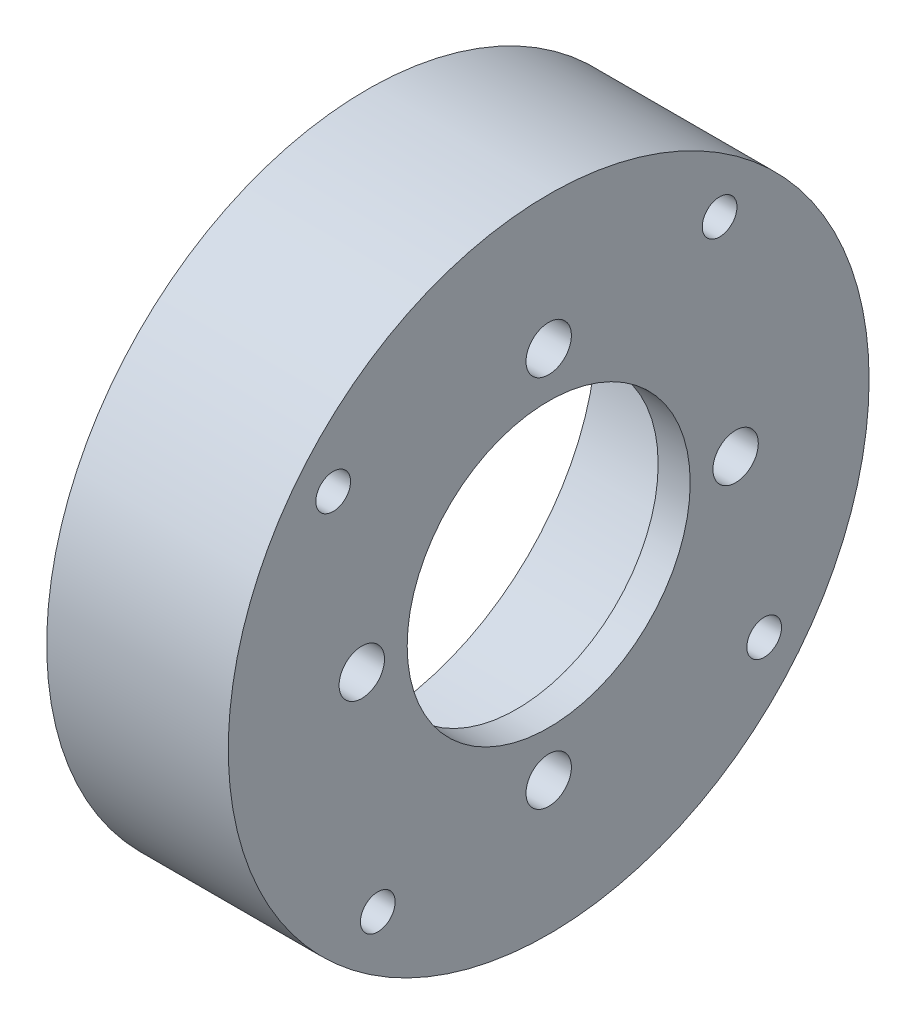
ISO-10303-21;
HEADER;
FILE_DESCRIPTION(('STEP AP214'),'2;1');
FILE_NAME('part.step','',(''),(''),'','','');
FILE_SCHEMA(('AUTOMOTIVE_DESIGN { 1 0 10303 214 1 1 1 1 }'));
ENDSEC;
DATA;
#1=APPLICATION_CONTEXT('core data for automotive mechanical design processes');
#2=APPLICATION_PROTOCOL_DEFINITION('international standard','automotive_design',2000,#1);
#3=PRODUCT_CONTEXT('',#1,'mechanical');
#4=PRODUCT('Part','Part','',(#3));
#5=PRODUCT_RELATED_PRODUCT_CATEGORY('part','',(#4));
#6=PRODUCT_DEFINITION_FORMATION('','',#4);
#7=PRODUCT_DEFINITION_CONTEXT('part definition',#1,'design');
#8=PRODUCT_DEFINITION('design','',#6,#7);
#9=PRODUCT_DEFINITION_SHAPE('','',#8);
#10=(LENGTH_UNIT() NAMED_UNIT(*) SI_UNIT(.MILLI.,.METRE.));
#11=(NAMED_UNIT(*) PLANE_ANGLE_UNIT() SI_UNIT($,.RADIAN.));
#12=(NAMED_UNIT(*) SI_UNIT($,.STERADIAN.) SOLID_ANGLE_UNIT());
#13=UNCERTAINTY_MEASURE_WITH_UNIT(LENGTH_MEASURE(1.E-05),#10,'distance_accuracy_value','');
#14=(GEOMETRIC_REPRESENTATION_CONTEXT(3) GLOBAL_UNCERTAINTY_ASSIGNED_CONTEXT((#13)) GLOBAL_UNIT_ASSIGNED_CONTEXT((#10,
#11,#12)) REPRESENTATION_CONTEXT('',''));
#15=CARTESIAN_POINT('',(0.,0.,0.));
#16=DIRECTION('',(0.,0.,1.));
#17=DIRECTION('',(1.,0.,0.));
#18=AXIS2_PLACEMENT_3D('',#15,#16,#17);
#19=CARTESIAN_POINT('',(0.,0.,0.));
#20=DIRECTION('',(1.,0.,0.));
#21=DIRECTION('',(0.,0.,-1.));
#22=AXIS2_PLACEMENT_3D('',#19,#20,#21);
#23=PLANE('',#22);
#24=CARTESIAN_POINT('',(0.,16.,20.1757899473602));
#25=DIRECTION('',(1.,0.,0.));
#26=DIRECTION('',(0.,0.,-1.));
#27=AXIS2_PLACEMENT_3D('',#24,#25,#26);
#28=CIRCLE('',#27,1.625);
#29=CARTESIAN_POINT('',(0.,16.,18.5507899473602));
#30=VERTEX_POINT('',#29);
#31=EDGE_CURVE('E91',#30,#30,#28,.T.);
#32=ORIENTED_EDGE('',*,*,#31,.T.);
#33=EDGE_LOOP('',(#32));
#34=FACE_BOUND('',#33,.T.);
#35=CARTESIAN_POINT('',(0.,20.1757899473601,-16.0000000000001));
#36=DIRECTION('',(1.,0.,0.));
#37=DIRECTION('',(0.,0.,-1.));
#38=AXIS2_PLACEMENT_3D('',#35,#36,#37);
#39=CIRCLE('',#38,1.625);
#40=CARTESIAN_POINT('',(0.,20.1757899473601,-17.6250000000001));
#41=VERTEX_POINT('',#40);
#42=EDGE_CURVE('E106',#41,#41,#39,.T.);
#43=ORIENTED_EDGE('',*,*,#42,.T.);
#44=EDGE_LOOP('',(#43));
#45=FACE_BOUND('',#44,.T.);
#46=CARTESIAN_POINT('',(0.,-16.0000000000001,-20.1757899473601));
#47=DIRECTION('',(1.,0.,0.));
#48=DIRECTION('',(0.,0.,-1.));
#49=AXIS2_PLACEMENT_3D('',#46,#47,#48);
#50=CIRCLE('',#49,1.625);
#51=CARTESIAN_POINT('',(0.,-16.0000000000001,-21.8007899473601));
#52=VERTEX_POINT('',#51);
#53=EDGE_CURVE('E100',#52,#52,#50,.T.);
#54=ORIENTED_EDGE('',*,*,#53,.T.);
#55=EDGE_LOOP('',(#54));
#56=FACE_BOUND('',#55,.T.);
#57=CARTESIAN_POINT('',(0.,-20.17578994736,16.0000000000002));
#58=DIRECTION('',(1.,0.,0.));
#59=DIRECTION('',(0.,0.,-1.));
#60=AXIS2_PLACEMENT_3D('',#57,#58,#59);
#61=CIRCLE('',#60,1.625);
#62=CARTESIAN_POINT('',(0.,-20.17578994736,14.3750000000002));
#63=VERTEX_POINT('',#62);
#64=EDGE_CURVE('E94',#63,#63,#61,.T.);
#65=ORIENTED_EDGE('',*,*,#64,.T.);
#66=EDGE_LOOP('',(#65));
#67=FACE_BOUND('',#66,.T.);
#68=CARTESIAN_POINT('',(0.,0.,0.));
#69=DIRECTION('',(1.,0.,0.));
#70=DIRECTION('',(0.,0.,-1.));
#71=AXIS2_PLACEMENT_3D('',#68,#69,#70);
#72=CIRCLE('',#71,30.);
#73=CARTESIAN_POINT('',(0.,0.,-30.));
#74=VERTEX_POINT('',#73);
#75=EDGE_CURVE('E10',#74,#74,#72,.T.);
#76=ORIENTED_EDGE('',*,*,#75,.F.);
#77=EDGE_LOOP('',(#76));
#78=FACE_BOUND('',#77,.T.);
#79=CARTESIAN_POINT('',(0.,0.,0.));
#80=DIRECTION('',(1.,0.,0.));
#81=DIRECTION('',(0.,0.,-1.));
#82=AXIS2_PLACEMENT_3D('',#79,#80,#81);
#83=CIRCLE('',#82,21.5);
#84=CARTESIAN_POINT('',(0.,0.,-21.5));
#85=VERTEX_POINT('',#84);
#86=EDGE_CURVE('E50',#85,#85,#83,.T.);
#87=ORIENTED_EDGE('',*,*,#86,.T.);
#88=EDGE_LOOP('',(#87));
#89=FACE_BOUND('',#88,.T.);
#90=ADVANCED_FACE('F43',(#34,#45,#56,#67,#78,#89),#23,.F.);
#91=CARTESIAN_POINT('',(14.,0.,0.));
#92=DIRECTION('',(-1.,0.,0.));
#93=DIRECTION('',(0.,0.,1.));
#94=AXIS2_PLACEMENT_3D('',#91,#92,#93);
#95=CYLINDRICAL_SURFACE('',#94,30.);
#96=ORIENTED_EDGE('',*,*,#75,.T.);
#97=EDGE_LOOP('',(#96));
#98=FACE_BOUND('',#97,.T.);
#99=CARTESIAN_POINT('',(17.,0.,0.));
#100=DIRECTION('',(1.,0.,0.));
#101=DIRECTION('',(0.,0.,-1.));
#102=AXIS2_PLACEMENT_3D('',#99,#100,#101);
#103=CIRCLE('',#102,30.);
#104=CARTESIAN_POINT('',(17.,0.,-30.));
#105=VERTEX_POINT('',#104);
#106=EDGE_CURVE('E58',#105,#105,#103,.T.);
#107=ORIENTED_EDGE('',*,*,#106,.F.);
#108=EDGE_LOOP('',(#107));
#109=FACE_BOUND('',#108,.T.);
#110=ADVANCED_FACE('F45',(#98,#109),#95,.T.);
#111=CARTESIAN_POINT('',(14.,0.,0.));
#112=DIRECTION('',(-1.,0.,0.));
#113=DIRECTION('',(0.,0.,1.));
#114=AXIS2_PLACEMENT_3D('',#111,#112,#113);
#115=CYLINDRICAL_SURFACE('',#114,21.5);
#116=CARTESIAN_POINT('',(14.,0.,0.));
#117=DIRECTION('',(1.,0.,0.));
#118=DIRECTION('',(0.,0.,-1.));
#119=AXIS2_PLACEMENT_3D('',#116,#117,#118);
#120=CIRCLE('',#119,21.5);
#121=CARTESIAN_POINT('',(14.,0.,-21.5));
#122=VERTEX_POINT('',#121);
#123=EDGE_CURVE('E54',#122,#122,#120,.T.);
#124=ORIENTED_EDGE('',*,*,#123,.T.);
#125=EDGE_LOOP('',(#124));
#126=FACE_BOUND('',#125,.T.);
#127=ORIENTED_EDGE('',*,*,#86,.F.);
#128=EDGE_LOOP('',(#127));
#129=FACE_BOUND('',#128,.T.);
#130=ADVANCED_FACE('F161',(#126,#129),#115,.F.);
#131=CARTESIAN_POINT('',(14.,0.,0.));
#132=DIRECTION('',(1.,0.,0.));
#133=DIRECTION('',(0.,0.,-1.));
#134=AXIS2_PLACEMENT_3D('',#131,#132,#133);
#135=PLANE('',#134);
#136=CARTESIAN_POINT('',(14.,1.83302770289265E-13,17.5));
#137=DIRECTION('',(1.,0.,0.));
#138=DIRECTION('',(0.,0.,-1.));
#139=AXIS2_PLACEMENT_3D('',#136,#137,#138);
#140=CIRCLE('',#139,2.125);
#141=CARTESIAN_POINT('',(14.,1.83302770289265E-13,15.375));
#142=VERTEX_POINT('',#141);
#143=EDGE_CURVE('E88',#142,#142,#140,.T.);
#144=ORIENTED_EDGE('',*,*,#143,.T.);
#145=EDGE_LOOP('',(#144));
#146=FACE_BOUND('',#145,.T.);
#147=CARTESIAN_POINT('',(14.,-17.5,1.2220184685951E-13));
#148=DIRECTION('',(1.,0.,0.));
#149=DIRECTION('',(0.,0.,-1.));
#150=AXIS2_PLACEMENT_3D('',#147,#148,#149);
#151=CIRCLE('',#150,2.125);
#152=CARTESIAN_POINT('',(14.,-17.5,-2.12499999999988));
#153=VERTEX_POINT('',#152);
#154=EDGE_CURVE('E82',#153,#153,#151,.T.);
#155=ORIENTED_EDGE('',*,*,#154,.T.);
#156=EDGE_LOOP('',(#155));
#157=FACE_BOUND('',#156,.T.);
#158=CARTESIAN_POINT('',(14.,0.,-17.5));
#159=DIRECTION('',(1.,0.,0.));
#160=DIRECTION('',(0.,0.,-1.));
#161=AXIS2_PLACEMENT_3D('',#158,#159,#160);
#162=CIRCLE('',#161,2.125);
#163=CARTESIAN_POINT('',(14.,0.,-19.625));
#164=VERTEX_POINT('',#163);
#165=EDGE_CURVE('E76',#164,#164,#162,.T.);
#166=ORIENTED_EDGE('',*,*,#165,.T.);
#167=EDGE_LOOP('',(#166));
#168=FACE_BOUND('',#167,.T.);
#169=CARTESIAN_POINT('',(14.,0.,0.));
#170=DIRECTION('',(1.,0.,0.));
#171=DIRECTION('',(0.,0.,-1.));
#172=AXIS2_PLACEMENT_3D('',#169,#170,#171);
#173=CIRCLE('',#172,13.25);
#174=CARTESIAN_POINT('',(14.,0.,-13.25));
#175=VERTEX_POINT('',#174);
#176=EDGE_CURVE('E70',#175,#175,#173,.T.);
#177=ORIENTED_EDGE('',*,*,#176,.T.);
#178=EDGE_LOOP('',(#177));
#179=FACE_BOUND('',#178,.T.);
#180=CARTESIAN_POINT('',(14.,17.5,0.));
#181=DIRECTION('',(1.,0.,0.));
#182=DIRECTION('',(0.,0.,-1.));
#183=AXIS2_PLACEMENT_3D('',#180,#181,#182);
#184=CIRCLE('',#183,2.125);
#185=CARTESIAN_POINT('',(14.,17.5,-2.125));
#186=VERTEX_POINT('',#185);
#187=EDGE_CURVE('E64',#186,#186,#184,.T.);
#188=ORIENTED_EDGE('',*,*,#187,.T.);
#189=EDGE_LOOP('',(#188));
#190=FACE_BOUND('',#189,.T.);
#191=ORIENTED_EDGE('',*,*,#123,.F.);
#192=EDGE_LOOP('',(#191));
#193=FACE_BOUND('',#192,.T.);
#194=ADVANCED_FACE('F131',(#146,#157,#168,#179,#190,#193),#135,.F.);
#195=CARTESIAN_POINT('',(17.,0.,0.));
#196=DIRECTION('',(1.,0.,0.));
#197=DIRECTION('',(0.,0.,-1.));
#198=AXIS2_PLACEMENT_3D('',#195,#196,#197);
#199=PLANE('',#198);
#200=CARTESIAN_POINT('',(17.,16.,20.1757899473602));
#201=DIRECTION('',(1.,0.,0.));
#202=DIRECTION('',(0.,0.,-1.));
#203=AXIS2_PLACEMENT_3D('',#200,#201,#202);
#204=CIRCLE('',#203,1.625);
#205=CARTESIAN_POINT('',(17.,16.,18.5507899473602));
#206=VERTEX_POINT('',#205);
#207=EDGE_CURVE('E112',#206,#206,#204,.T.);
#208=ORIENTED_EDGE('',*,*,#207,.F.);
#209=EDGE_LOOP('',(#208));
#210=FACE_BOUND('',#209,.T.);
#211=CARTESIAN_POINT('',(17.,20.1757899473601,-16.0000000000001));
#212=DIRECTION('',(1.,0.,0.));
#213=DIRECTION('',(0.,0.,-1.));
#214=AXIS2_PLACEMENT_3D('',#211,#212,#213);
#215=CIRCLE('',#214,1.625);
#216=CARTESIAN_POINT('',(17.,20.1757899473601,-17.6250000000001));
#217=VERTEX_POINT('',#216);
#218=EDGE_CURVE('E109',#217,#217,#215,.T.);
#219=ORIENTED_EDGE('',*,*,#218,.F.);
#220=EDGE_LOOP('',(#219));
#221=FACE_BOUND('',#220,.T.);
#222=CARTESIAN_POINT('',(17.,-16.0000000000001,-20.1757899473601));
#223=DIRECTION('',(1.,0.,0.));
#224=DIRECTION('',(0.,0.,-1.));
#225=AXIS2_PLACEMENT_3D('',#222,#223,#224);
#226=CIRCLE('',#225,1.625);
#227=CARTESIAN_POINT('',(17.,-16.0000000000001,-21.8007899473601));
#228=VERTEX_POINT('',#227);
#229=EDGE_CURVE('E103',#228,#228,#226,.T.);
#230=ORIENTED_EDGE('',*,*,#229,.F.);
#231=EDGE_LOOP('',(#230));
#232=FACE_BOUND('',#231,.T.);
#233=CARTESIAN_POINT('',(17.,-20.17578994736,16.0000000000002));
#234=DIRECTION('',(1.,0.,0.));
#235=DIRECTION('',(0.,0.,-1.));
#236=AXIS2_PLACEMENT_3D('',#233,#234,#235);
#237=CIRCLE('',#236,1.625);
#238=CARTESIAN_POINT('',(17.,-20.17578994736,14.3750000000002));
#239=VERTEX_POINT('',#238);
#240=EDGE_CURVE('E97',#239,#239,#237,.T.);
#241=ORIENTED_EDGE('',*,*,#240,.F.);
#242=EDGE_LOOP('',(#241));
#243=FACE_BOUND('',#242,.T.);
#244=CARTESIAN_POINT('',(17.,-17.5,1.2220184685951E-13));
#245=DIRECTION('',(1.,0.,0.));
#246=DIRECTION('',(0.,0.,-1.));
#247=AXIS2_PLACEMENT_3D('',#244,#245,#246);
#248=CIRCLE('',#247,2.125);
#249=CARTESIAN_POINT('',(17.,-17.5,-2.12499999999988));
#250=VERTEX_POINT('',#249);
#251=EDGE_CURVE('E79',#250,#250,#248,.T.);
#252=ORIENTED_EDGE('',*,*,#251,.F.);
#253=EDGE_LOOP('',(#252));
#254=FACE_BOUND('',#253,.T.);
#255=CARTESIAN_POINT('',(17.,0.,0.));
#256=DIRECTION('',(1.,0.,0.));
#257=DIRECTION('',(0.,0.,-1.));
#258=AXIS2_PLACEMENT_3D('',#255,#256,#257);
#259=CIRCLE('',#258,13.25);
#260=CARTESIAN_POINT('',(17.,0.,-13.25));
#261=VERTEX_POINT('',#260);
#262=EDGE_CURVE('E67',#261,#261,#259,.T.);
#263=ORIENTED_EDGE('',*,*,#262,.F.);
#264=EDGE_LOOP('',(#263));
#265=FACE_BOUND('',#264,.T.);
#266=ORIENTED_EDGE('',*,*,#106,.T.);
#267=EDGE_LOOP('',(#266));
#268=FACE_BOUND('',#267,.T.);
#269=CARTESIAN_POINT('',(17.,17.5,0.));
#270=DIRECTION('',(1.,0.,0.));
#271=DIRECTION('',(0.,0.,-1.));
#272=AXIS2_PLACEMENT_3D('',#269,#270,#271);
#273=CIRCLE('',#272,2.125);
#274=CARTESIAN_POINT('',(17.,17.5,-2.125));
#275=VERTEX_POINT('',#274);
#276=EDGE_CURVE('E63',#275,#275,#273,.T.);
#277=ORIENTED_EDGE('',*,*,#276,.F.);
#278=EDGE_LOOP('',(#277));
#279=FACE_BOUND('',#278,.T.);
#280=CARTESIAN_POINT('',(17.,0.,-17.5));
#281=DIRECTION('',(1.,0.,0.));
#282=DIRECTION('',(0.,0.,-1.));
#283=AXIS2_PLACEMENT_3D('',#280,#281,#282);
#284=CIRCLE('',#283,2.125);
#285=CARTESIAN_POINT('',(17.,0.,-19.625));
#286=VERTEX_POINT('',#285);
#287=EDGE_CURVE('E73',#286,#286,#284,.T.);
#288=ORIENTED_EDGE('',*,*,#287,.F.);
#289=EDGE_LOOP('',(#288));
#290=FACE_BOUND('',#289,.T.);
#291=CARTESIAN_POINT('',(17.,1.83302770289265E-13,17.5));
#292=DIRECTION('',(1.,0.,0.));
#293=DIRECTION('',(0.,0.,-1.));
#294=AXIS2_PLACEMENT_3D('',#291,#292,#293);
#295=CIRCLE('',#294,2.125);
#296=CARTESIAN_POINT('',(17.,1.83302770289265E-13,15.375));
#297=VERTEX_POINT('',#296);
#298=EDGE_CURVE('E85',#297,#297,#295,.T.);
#299=ORIENTED_EDGE('',*,*,#298,.F.);
#300=EDGE_LOOP('',(#299));
#301=FACE_BOUND('',#300,.T.);
#302=ADVANCED_FACE('F127',(#210,#221,#232,#243,#254,#265,#268,#279,#290,#301),#199,.T.);
#303=CARTESIAN_POINT('',(17.,17.5,0.));
#304=DIRECTION('',(-1.,0.,0.));
#305=DIRECTION('',(0.,0.,1.));
#306=AXIS2_PLACEMENT_3D('',#303,#304,#305);
#307=CYLINDRICAL_SURFACE('',#306,2.125);
#308=ORIENTED_EDGE('',*,*,#276,.T.);
#309=EDGE_LOOP('',(#308));
#310=FACE_BOUND('',#309,.T.);
#311=ORIENTED_EDGE('',*,*,#187,.F.);
#312=EDGE_LOOP('',(#311));
#313=FACE_BOUND('',#312,.T.);
#314=ADVANCED_FACE('F130',(#310,#313),#307,.F.);
#315=CARTESIAN_POINT('',(17.,0.,0.));
#316=DIRECTION('',(-1.,0.,0.));
#317=DIRECTION('',(0.,0.,1.));
#318=AXIS2_PLACEMENT_3D('',#315,#316,#317);
#319=CYLINDRICAL_SURFACE('',#318,13.25);
#320=ORIENTED_EDGE('',*,*,#262,.T.);
#321=EDGE_LOOP('',(#320));
#322=FACE_BOUND('',#321,.T.);
#323=ORIENTED_EDGE('',*,*,#176,.F.);
#324=EDGE_LOOP('',(#323));
#325=FACE_BOUND('',#324,.T.);
#326=ADVANCED_FACE('F247',(#322,#325),#319,.F.);
#327=CARTESIAN_POINT('',(17.,0.,-17.5));
#328=DIRECTION('',(-1.,0.,0.));
#329=DIRECTION('',(0.,0.,1.));
#330=AXIS2_PLACEMENT_3D('',#327,#328,#329);
#331=CYLINDRICAL_SURFACE('',#330,2.125);
#332=ORIENTED_EDGE('',*,*,#287,.T.);
#333=EDGE_LOOP('',(#332));
#334=FACE_BOUND('',#333,.T.);
#335=ORIENTED_EDGE('',*,*,#165,.F.);
#336=EDGE_LOOP('',(#335));
#337=FACE_BOUND('',#336,.T.);
#338=ADVANCED_FACE('F238',(#334,#337),#331,.F.);
#339=CARTESIAN_POINT('',(17.,-17.5,1.2220184685951E-13));
#340=DIRECTION('',(-1.,0.,0.));
#341=DIRECTION('',(0.,0.,1.));
#342=AXIS2_PLACEMENT_3D('',#339,#340,#341);
#343=CYLINDRICAL_SURFACE('',#342,2.125);
#344=ORIENTED_EDGE('',*,*,#251,.T.);
#345=EDGE_LOOP('',(#344));
#346=FACE_BOUND('',#345,.T.);
#347=ORIENTED_EDGE('',*,*,#154,.F.);
#348=EDGE_LOOP('',(#347));
#349=FACE_BOUND('',#348,.T.);
#350=ADVANCED_FACE('F155',(#346,#349),#343,.F.);
#351=CARTESIAN_POINT('',(17.,1.83302770289265E-13,17.5));
#352=DIRECTION('',(-1.,0.,0.));
#353=DIRECTION('',(0.,0.,1.));
#354=AXIS2_PLACEMENT_3D('',#351,#352,#353);
#355=CYLINDRICAL_SURFACE('',#354,2.125);
#356=ORIENTED_EDGE('',*,*,#298,.T.);
#357=EDGE_LOOP('',(#356));
#358=FACE_BOUND('',#357,.T.);
#359=ORIENTED_EDGE('',*,*,#143,.F.);
#360=EDGE_LOOP('',(#359));
#361=FACE_BOUND('',#360,.T.);
#362=ADVANCED_FACE('F151',(#358,#361),#355,.F.);
#363=CARTESIAN_POINT('',(0.,-20.17578994736,16.0000000000002));
#364=DIRECTION('',(1.,0.,0.));
#365=DIRECTION('',(0.,0.,-1.));
#366=AXIS2_PLACEMENT_3D('',#363,#364,#365);
#367=CYLINDRICAL_SURFACE('',#366,1.625);
#368=ORIENTED_EDGE('',*,*,#64,.F.);
#369=EDGE_LOOP('',(#368));
#370=FACE_BOUND('',#369,.T.);
#371=ORIENTED_EDGE('',*,*,#240,.T.);
#372=EDGE_LOOP('',(#371));
#373=FACE_BOUND('',#372,.T.);
#374=ADVANCED_FACE('F154',(#370,#373),#367,.F.);
#375=CARTESIAN_POINT('',(0.,-16.0000000000001,-20.1757899473601));
#376=DIRECTION('',(1.,0.,0.));
#377=DIRECTION('',(0.,0.,-1.));
#378=AXIS2_PLACEMENT_3D('',#375,#376,#377);
#379=CYLINDRICAL_SURFACE('',#378,1.625);
#380=ORIENTED_EDGE('',*,*,#53,.F.);
#381=EDGE_LOOP('',(#380));
#382=FACE_BOUND('',#381,.T.);
#383=ORIENTED_EDGE('',*,*,#229,.T.);
#384=EDGE_LOOP('',(#383));
#385=FACE_BOUND('',#384,.T.);
#386=ADVANCED_FACE('F200',(#382,#385),#379,.F.);
#387=CARTESIAN_POINT('',(0.,20.1757899473601,-16.0000000000001));
#388=DIRECTION('',(1.,0.,0.));
#389=DIRECTION('',(0.,0.,-1.));
#390=AXIS2_PLACEMENT_3D('',#387,#388,#389);
#391=CYLINDRICAL_SURFACE('',#390,1.625);
#392=ORIENTED_EDGE('',*,*,#42,.F.);
#393=EDGE_LOOP('',(#392));
#394=FACE_BOUND('',#393,.T.);
#395=ORIENTED_EDGE('',*,*,#218,.T.);
#396=EDGE_LOOP('',(#395));
#397=FACE_BOUND('',#396,.T.);
#398=ADVANCED_FACE('F123',(#394,#397),#391,.F.);
#399=CARTESIAN_POINT('',(0.,16.,20.1757899473602));
#400=DIRECTION('',(1.,0.,0.));
#401=DIRECTION('',(0.,0.,-1.));
#402=AXIS2_PLACEMENT_3D('',#399,#400,#401);
#403=CYLINDRICAL_SURFACE('',#402,1.625);
#404=ORIENTED_EDGE('',*,*,#31,.F.);
#405=EDGE_LOOP('',(#404));
#406=FACE_BOUND('',#405,.T.);
#407=ORIENTED_EDGE('',*,*,#207,.T.);
#408=EDGE_LOOP('',(#407));
#409=FACE_BOUND('',#408,.T.);
#410=ADVANCED_FACE('F120',(#406,#409),#403,.F.);
#411=CLOSED_SHELL('',(#90,#110,#130,#194,#302,#314,#326,#338,#350,#362,#374,#386,#398,#410));
#412=MANIFOLD_SOLID_BREP('B2',#411);
#413=ADVANCED_BREP_SHAPE_REPRESENTATION('',(#18,#412),#14);
#414=SHAPE_DEFINITION_REPRESENTATION(#9,#413);
ENDSEC;
END-ISO-10303-21;
